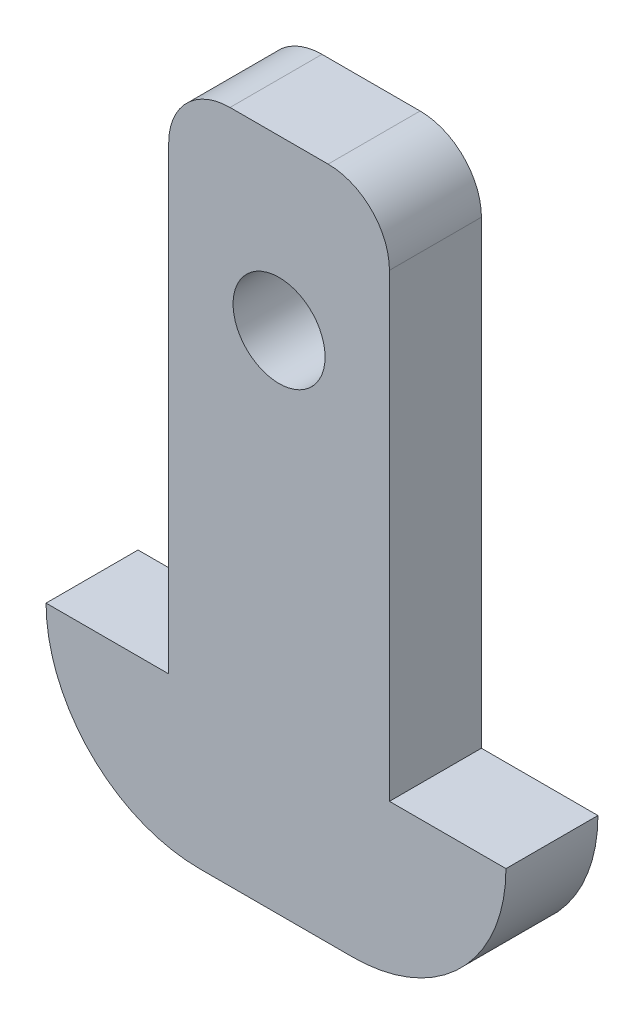
ISO-10303-21;
HEADER;
FILE_DESCRIPTION(('STEP AP214'),'2;1');
FILE_NAME('part.step','',(''),(''),'','','');
FILE_SCHEMA(('AUTOMOTIVE_DESIGN { 1 0 10303 214 1 1 1 1 }'));
ENDSEC;
DATA;
#1=APPLICATION_CONTEXT('core data for automotive mechanical design processes');
#2=APPLICATION_PROTOCOL_DEFINITION('international standard','automotive_design',2000,#1);
#3=PRODUCT_CONTEXT('',#1,'mechanical');
#4=PRODUCT('Part','Part','',(#3));
#5=PRODUCT_RELATED_PRODUCT_CATEGORY('part','',(#4));
#6=PRODUCT_DEFINITION_FORMATION('','',#4);
#7=PRODUCT_DEFINITION_CONTEXT('part definition',#1,'design');
#8=PRODUCT_DEFINITION('design','',#6,#7);
#9=PRODUCT_DEFINITION_SHAPE('','',#8);
#10=(LENGTH_UNIT() NAMED_UNIT(*) SI_UNIT(.MILLI.,.METRE.));
#11=(NAMED_UNIT(*) PLANE_ANGLE_UNIT() SI_UNIT($,.RADIAN.));
#12=(NAMED_UNIT(*) SI_UNIT($,.STERADIAN.) SOLID_ANGLE_UNIT());
#13=UNCERTAINTY_MEASURE_WITH_UNIT(LENGTH_MEASURE(1.E-05),#10,'distance_accuracy_value','');
#14=(GEOMETRIC_REPRESENTATION_CONTEXT(3) GLOBAL_UNCERTAINTY_ASSIGNED_CONTEXT((#13)) GLOBAL_UNIT_ASSIGNED_CONTEXT((#10,
#11,#12)) REPRESENTATION_CONTEXT('',''));
#15=CARTESIAN_POINT('',(0.,0.,0.));
#16=DIRECTION('',(0.,0.,1.));
#17=DIRECTION('',(1.,0.,0.));
#18=AXIS2_PLACEMENT_3D('',#15,#16,#17);
#19=CARTESIAN_POINT('',(15.,-5.,3.));
#20=DIRECTION('',(0.,1.,0.));
#21=DIRECTION('',(-1.,0.,0.));
#22=AXIS2_PLACEMENT_3D('',#19,#20,#21);
#23=PLANE('',#22);
#24=DIRECTION('',(1.,0.,0.));
#25=VECTOR('',#24,1.);
#26=CARTESIAN_POINT('',(15.,-5.,3.));
#27=LINE('',#26,#25);
#28=CARTESIAN_POINT('',(5.,-5.,3.));
#29=VERTEX_POINT('',#28);
#30=CARTESIAN_POINT('',(10.,-5.,3.));
#31=VERTEX_POINT('',#30);
#32=EDGE_CURVE('E131',#29,#31,#27,.T.);
#33=ORIENTED_EDGE('',*,*,#32,.F.);
#34=DIRECTION('',(0.,0.,-1.));
#35=VECTOR('',#34,1.);
#36=CARTESIAN_POINT('',(5.,-5.,3.));
#37=LINE('',#36,#35);
#38=CARTESIAN_POINT('',(5.,-5.,0.));
#39=VERTEX_POINT('',#38);
#40=EDGE_CURVE('E156',#29,#39,#37,.T.);
#41=ORIENTED_EDGE('',*,*,#40,.T.);
#42=DIRECTION('',(1.,0.,0.));
#43=VECTOR('',#42,1.);
#44=CARTESIAN_POINT('',(15.,-5.,0.));
#45=LINE('',#44,#43);
#46=CARTESIAN_POINT('',(10.,-5.,0.));
#47=VERTEX_POINT('',#46);
#48=EDGE_CURVE('E237',#39,#47,#45,.T.);
#49=ORIENTED_EDGE('',*,*,#48,.T.);
#50=DIRECTION('',(0.,0.,-1.));
#51=VECTOR('',#50,1.);
#52=CARTESIAN_POINT('',(10.,-5.,3.));
#53=LINE('',#52,#51);
#54=EDGE_CURVE('E152',#47,#31,#53,.F.);
#55=ORIENTED_EDGE('',*,*,#54,.T.);
#56=EDGE_LOOP('',(#33,#41,#49,#55));
#57=FACE_BOUND('',#56,.T.);
#58=ADVANCED_FACE('F45',(#57),#23,.F.);
#59=CARTESIAN_POINT('',(11.2,0.,3.));
#60=DIRECTION('',(0.,-1.,0.));
#61=DIRECTION('',(0.,0.,-1.));
#62=AXIS2_PLACEMENT_3D('',#59,#60,#61);
#63=PLANE('',#62);
#64=DIRECTION('',(-1.,0.,0.));
#65=VECTOR('',#64,1.);
#66=CARTESIAN_POINT('',(11.2,0.,0.));
#67=LINE('',#66,#65);
#68=CARTESIAN_POINT('',(15.,0.,0.));
#69=VERTEX_POINT('',#68);
#70=CARTESIAN_POINT('',(11.2,0.,0.));
#71=VERTEX_POINT('',#70);
#72=EDGE_CURVE('E221',#69,#71,#67,.T.);
#73=ORIENTED_EDGE('',*,*,#72,.T.);
#74=DIRECTION('',(0.,0.,-1.));
#75=VECTOR('',#74,1.);
#76=CARTESIAN_POINT('',(11.2,0.,3.));
#77=LINE('',#76,#75);
#78=CARTESIAN_POINT('',(11.2,0.,3.));
#79=VERTEX_POINT('',#78);
#80=EDGE_CURVE('E145',#79,#71,#77,.T.);
#81=ORIENTED_EDGE('',*,*,#80,.F.);
#82=DIRECTION('',(-1.,0.,0.));
#83=VECTOR('',#82,1.);
#84=CARTESIAN_POINT('',(11.2,0.,3.));
#85=LINE('',#84,#83);
#86=CARTESIAN_POINT('',(15.,0.,3.));
#87=VERTEX_POINT('',#86);
#88=EDGE_CURVE('E128',#87,#79,#85,.T.);
#89=ORIENTED_EDGE('',*,*,#88,.F.);
#90=DIRECTION('',(0.,0.,-1.));
#91=VECTOR('',#90,1.);
#92=CARTESIAN_POINT('',(15.,0.,3.));
#93=LINE('',#92,#91);
#94=EDGE_CURVE('E142',#87,#69,#93,.T.);
#95=ORIENTED_EDGE('',*,*,#94,.T.);
#96=EDGE_LOOP('',(#73,#81,#89,#95));
#97=FACE_BOUND('',#96,.T.);
#98=ADVANCED_FACE('F141',(#97),#63,.F.);
#99=CARTESIAN_POINT('',(11.2,17.,3.));
#100=DIRECTION('',(-1.,0.,0.));
#101=DIRECTION('',(0.,-1.,0.));
#102=AXIS2_PLACEMENT_3D('',#99,#100,#101);
#103=PLANE('',#102);
#104=DIRECTION('',(0.,1.,0.));
#105=VECTOR('',#104,1.);
#106=CARTESIAN_POINT('',(11.2,17.,0.));
#107=LINE('',#106,#105);
#108=CARTESIAN_POINT('',(11.2,15.,0.));
#109=VERTEX_POINT('',#108);
#110=EDGE_CURVE('E215',#71,#109,#107,.T.);
#111=ORIENTED_EDGE('',*,*,#110,.T.);
#112=DIRECTION('',(0.,0.,-1.));
#113=VECTOR('',#112,1.);
#114=CARTESIAN_POINT('',(11.2,15.,3.));
#115=LINE('',#114,#113);
#116=CARTESIAN_POINT('',(11.2,15.,3.));
#117=VERTEX_POINT('',#116);
#118=EDGE_CURVE('E11',#109,#117,#115,.F.);
#119=ORIENTED_EDGE('',*,*,#118,.T.);
#120=DIRECTION('',(0.,1.,0.));
#121=VECTOR('',#120,1.);
#122=CARTESIAN_POINT('',(11.2,17.,3.));
#123=LINE('',#122,#121);
#124=EDGE_CURVE('E147',#79,#117,#123,.T.);
#125=ORIENTED_EDGE('',*,*,#124,.F.);
#126=ORIENTED_EDGE('',*,*,#80,.T.);
#127=EDGE_LOOP('',(#111,#119,#125,#126));
#128=FACE_BOUND('',#127,.T.);
#129=ADVANCED_FACE('F259',(#128),#103,.F.);
#130=CARTESIAN_POINT('',(4.,17.,3.));
#131=DIRECTION('',(0.,-1.,0.));
#132=DIRECTION('',(0.,0.,-1.));
#133=AXIS2_PLACEMENT_3D('',#130,#131,#132);
#134=PLANE('',#133);
#135=DIRECTION('',(-1.,0.,0.));
#136=VECTOR('',#135,1.);
#137=CARTESIAN_POINT('',(4.,17.,0.));
#138=LINE('',#137,#136);
#139=CARTESIAN_POINT('',(9.2,17.,0.));
#140=VERTEX_POINT('',#139);
#141=CARTESIAN_POINT('',(6.,17.,0.));
#142=VERTEX_POINT('',#141);
#143=EDGE_CURVE('E209',#140,#142,#138,.T.);
#144=ORIENTED_EDGE('',*,*,#143,.T.);
#145=DIRECTION('',(0.,0.,-1.));
#146=VECTOR('',#145,1.);
#147=CARTESIAN_POINT('',(6.,17.,3.));
#148=LINE('',#147,#146);
#149=CARTESIAN_POINT('',(6.,17.,3.));
#150=VERTEX_POINT('',#149);
#151=EDGE_CURVE('E67',#142,#150,#148,.F.);
#152=ORIENTED_EDGE('',*,*,#151,.T.);
#153=DIRECTION('',(-1.,0.,0.));
#154=VECTOR('',#153,1.);
#155=CARTESIAN_POINT('',(4.,17.,3.));
#156=LINE('',#155,#154);
#157=CARTESIAN_POINT('',(9.2,17.,3.));
#158=VERTEX_POINT('',#157);
#159=EDGE_CURVE('E194',#158,#150,#156,.T.);
#160=ORIENTED_EDGE('',*,*,#159,.F.);
#161=DIRECTION('',(0.,0.,-1.));
#162=VECTOR('',#161,1.);
#163=CARTESIAN_POINT('',(9.2,17.,3.));
#164=LINE('',#163,#162);
#165=EDGE_CURVE('E181',#158,#140,#164,.T.);
#166=ORIENTED_EDGE('',*,*,#165,.T.);
#167=EDGE_LOOP('',(#144,#152,#160,#166));
#168=FACE_BOUND('',#167,.T.);
#169=ADVANCED_FACE('F212',(#168),#134,.F.);
#170=CARTESIAN_POINT('',(4.,0.,3.));
#171=DIRECTION('',(1.,0.,0.));
#172=DIRECTION('',(0.,0.,-1.));
#173=AXIS2_PLACEMENT_3D('',#170,#171,#172);
#174=PLANE('',#173);
#175=DIRECTION('',(0.,-1.,0.));
#176=VECTOR('',#175,1.);
#177=CARTESIAN_POINT('',(4.,0.,3.));
#178=LINE('',#177,#176);
#179=CARTESIAN_POINT('',(4.,15.,3.));
#180=VERTEX_POINT('',#179);
#181=CARTESIAN_POINT('',(4.,0.,3.));
#182=VERTEX_POINT('',#181);
#183=EDGE_CURVE('E192',#180,#182,#178,.T.);
#184=ORIENTED_EDGE('',*,*,#183,.F.);
#185=DIRECTION('',(0.,0.,-1.));
#186=VECTOR('',#185,1.);
#187=CARTESIAN_POINT('',(4.,15.,3.));
#188=LINE('',#187,#186);
#189=CARTESIAN_POINT('',(4.,15.,0.));
#190=VERTEX_POINT('',#189);
#191=EDGE_CURVE('E171',#180,#190,#188,.T.);
#192=ORIENTED_EDGE('',*,*,#191,.T.);
#193=DIRECTION('',(0.,-1.,0.));
#194=VECTOR('',#193,1.);
#195=CARTESIAN_POINT('',(4.,0.,0.));
#196=LINE('',#195,#194);
#197=CARTESIAN_POINT('',(4.,0.,0.));
#198=VERTEX_POINT('',#197);
#199=EDGE_CURVE('E211',#190,#198,#196,.T.);
#200=ORIENTED_EDGE('',*,*,#199,.T.);
#201=DIRECTION('',(0.,0.,-1.));
#202=VECTOR('',#201,1.);
#203=CARTESIAN_POINT('',(4.,0.,3.));
#204=LINE('',#203,#202);
#205=EDGE_CURVE('E158',#182,#198,#204,.T.);
#206=ORIENTED_EDGE('',*,*,#205,.F.);
#207=EDGE_LOOP('',(#184,#192,#200,#206));
#208=FACE_BOUND('',#207,.T.);
#209=ADVANCED_FACE('F198',(#208),#174,.F.);
#210=CARTESIAN_POINT('',(0.,0.,3.));
#211=DIRECTION('',(0.,-1.,0.));
#212=DIRECTION('',(0.,0.,-1.));
#213=AXIS2_PLACEMENT_3D('',#210,#211,#212);
#214=PLANE('',#213);
#215=DIRECTION('',(-1.,0.,0.));
#216=VECTOR('',#215,1.);
#217=CARTESIAN_POINT('',(0.,0.,0.));
#218=LINE('',#217,#216);
#219=CARTESIAN_POINT('',(0.,0.,0.));
#220=VERTEX_POINT('',#219);
#221=EDGE_CURVE('E219',#198,#220,#218,.T.);
#222=ORIENTED_EDGE('',*,*,#221,.T.);
#223=DIRECTION('',(0.,0.,-1.));
#224=VECTOR('',#223,1.);
#225=CARTESIAN_POINT('',(0.,0.,3.));
#226=LINE('',#225,#224);
#227=CARTESIAN_POINT('',(0.,0.,3.));
#228=VERTEX_POINT('',#227);
#229=EDGE_CURVE('E228',#228,#220,#226,.T.);
#230=ORIENTED_EDGE('',*,*,#229,.F.);
#231=DIRECTION('',(-1.,0.,0.));
#232=VECTOR('',#231,1.);
#233=CARTESIAN_POINT('',(0.,0.,3.));
#234=LINE('',#233,#232);
#235=EDGE_CURVE('E203',#182,#228,#234,.T.);
#236=ORIENTED_EDGE('',*,*,#235,.F.);
#237=ORIENTED_EDGE('',*,*,#205,.T.);
#238=EDGE_LOOP('',(#222,#230,#236,#237));
#239=FACE_BOUND('',#238,.T.);
#240=ADVANCED_FACE('F233',(#239),#214,.F.);
#241=CARTESIAN_POINT('',(0.,0.,3.));
#242=DIRECTION('',(0.,0.,-1.));
#243=DIRECTION('',(-1.,0.,0.));
#244=AXIS2_PLACEMENT_3D('',#241,#242,#243);
#245=PLANE('',#244);
#246=CARTESIAN_POINT('',(7.6,11.5,3.));
#247=DIRECTION('',(0.,0.,1.));
#248=DIRECTION('',(1.,0.,0.));
#249=AXIS2_PLACEMENT_3D('',#246,#247,#248);
#250=CIRCLE('',#249,1.5);
#251=CARTESIAN_POINT('',(9.1,11.5,3.));
#252=VERTEX_POINT('',#251);
#253=EDGE_CURVE('E246',#252,#252,#250,.T.);
#254=ORIENTED_EDGE('',*,*,#253,.F.);
#255=EDGE_LOOP('',(#254));
#256=FACE_BOUND('',#255,.T.);
#257=ORIENTED_EDGE('',*,*,#159,.T.);
#258=CARTESIAN_POINT('',(6.,15.,3.));
#259=DIRECTION('',(0.,0.,-1.));
#260=DIRECTION('',(-1.,0.,0.));
#261=AXIS2_PLACEMENT_3D('',#258,#259,#260);
#262=CIRCLE('',#261,2.);
#263=EDGE_CURVE('E54',#150,#180,#262,.F.);
#264=ORIENTED_EDGE('',*,*,#263,.T.);
#265=ORIENTED_EDGE('',*,*,#183,.T.);
#266=ORIENTED_EDGE('',*,*,#235,.T.);
#267=CARTESIAN_POINT('',(5.,0.,3.));
#268=DIRECTION('',(0.,0.,-1.));
#269=DIRECTION('',(-1.,0.,0.));
#270=AXIS2_PLACEMENT_3D('',#267,#268,#269);
#271=CIRCLE('',#270,5.);
#272=EDGE_CURVE('E136',#228,#29,#271,.F.);
#273=ORIENTED_EDGE('',*,*,#272,.T.);
#274=ORIENTED_EDGE('',*,*,#32,.T.);
#275=CARTESIAN_POINT('',(10.,0.,3.));
#276=DIRECTION('',(0.,0.,-1.));
#277=DIRECTION('',(-1.,0.,0.));
#278=AXIS2_PLACEMENT_3D('',#275,#276,#277);
#279=CIRCLE('',#278,5.);
#280=EDGE_CURVE('E125',#31,#87,#279,.F.);
#281=ORIENTED_EDGE('',*,*,#280,.T.);
#282=ORIENTED_EDGE('',*,*,#88,.T.);
#283=ORIENTED_EDGE('',*,*,#124,.T.);
#284=CARTESIAN_POINT('',(9.2,15.,3.));
#285=DIRECTION('',(0.,0.,-1.));
#286=DIRECTION('',(-1.,0.,0.));
#287=AXIS2_PLACEMENT_3D('',#284,#285,#286);
#288=CIRCLE('',#287,2.);
#289=EDGE_CURVE('E187',#117,#158,#288,.F.);
#290=ORIENTED_EDGE('',*,*,#289,.T.);
#291=EDGE_LOOP('',(#257,#264,#265,#266,#273,#274,#281,#282,#283,#290));
#292=FACE_BOUND('',#291,.T.);
#293=ADVANCED_FACE('F127',(#256,#292),#245,.F.);
#294=CARTESIAN_POINT('',(0.,0.,0.));
#295=DIRECTION('',(0.,0.,-1.));
#296=DIRECTION('',(-1.,0.,0.));
#297=AXIS2_PLACEMENT_3D('',#294,#295,#296);
#298=PLANE('',#297);
#299=CARTESIAN_POINT('',(7.6,11.5,0.));
#300=DIRECTION('',(0.,0.,1.));
#301=DIRECTION('',(1.,0.,0.));
#302=AXIS2_PLACEMENT_3D('',#299,#300,#301);
#303=CIRCLE('',#302,1.5);
#304=CARTESIAN_POINT('',(9.1,11.5,0.));
#305=VERTEX_POINT('',#304);
#306=EDGE_CURVE('E256',#305,#305,#303,.T.);
#307=ORIENTED_EDGE('',*,*,#306,.T.);
#308=EDGE_LOOP('',(#307));
#309=FACE_BOUND('',#308,.T.);
#310=ORIENTED_EDGE('',*,*,#199,.F.);
#311=CARTESIAN_POINT('',(6.,15.,0.));
#312=DIRECTION('',(0.,0.,-1.));
#313=DIRECTION('',(-1.,0.,0.));
#314=AXIS2_PLACEMENT_3D('',#311,#312,#313);
#315=CIRCLE('',#314,2.);
#316=EDGE_CURVE('E178',#190,#142,#315,.T.);
#317=ORIENTED_EDGE('',*,*,#316,.T.);
#318=ORIENTED_EDGE('',*,*,#143,.F.);
#319=CARTESIAN_POINT('',(9.2,15.,0.));
#320=DIRECTION('',(0.,0.,-1.));
#321=DIRECTION('',(-1.,0.,0.));
#322=AXIS2_PLACEMENT_3D('',#319,#320,#321);
#323=CIRCLE('',#322,2.);
#324=EDGE_CURVE('E175',#140,#109,#323,.T.);
#325=ORIENTED_EDGE('',*,*,#324,.T.);
#326=ORIENTED_EDGE('',*,*,#110,.F.);
#327=ORIENTED_EDGE('',*,*,#72,.F.);
#328=CARTESIAN_POINT('',(10.,0.,0.));
#329=DIRECTION('',(0.,0.,-1.));
#330=DIRECTION('',(-1.,0.,0.));
#331=AXIS2_PLACEMENT_3D('',#328,#329,#330);
#332=CIRCLE('',#331,5.);
#333=EDGE_CURVE('E150',#69,#47,#332,.T.);
#334=ORIENTED_EDGE('',*,*,#333,.T.);
#335=ORIENTED_EDGE('',*,*,#48,.F.);
#336=CARTESIAN_POINT('',(5.,0.,0.));
#337=DIRECTION('',(0.,0.,-1.));
#338=DIRECTION('',(-1.,0.,0.));
#339=AXIS2_PLACEMENT_3D('',#336,#337,#338);
#340=CIRCLE('',#339,5.);
#341=EDGE_CURVE('E137',#39,#220,#340,.T.);
#342=ORIENTED_EDGE('',*,*,#341,.T.);
#343=ORIENTED_EDGE('',*,*,#221,.F.);
#344=EDGE_LOOP('',(#310,#317,#318,#325,#326,#327,#334,#335,#342,#343));
#345=FACE_BOUND('',#344,.T.);
#346=ADVANCED_FACE('F208',(#309,#345),#298,.T.);
#347=CARTESIAN_POINT('',(7.6,11.5,0.));
#348=DIRECTION('',(0.,0.,1.));
#349=DIRECTION('',(1.,0.,0.));
#350=AXIS2_PLACEMENT_3D('',#347,#348,#349);
#351=CYLINDRICAL_SURFACE('',#350,1.5);
#352=ORIENTED_EDGE('',*,*,#306,.F.);
#353=EDGE_LOOP('',(#352));
#354=FACE_BOUND('',#353,.T.);
#355=ORIENTED_EDGE('',*,*,#253,.T.);
#356=EDGE_LOOP('',(#355));
#357=FACE_BOUND('',#356,.T.);
#358=ADVANCED_FACE('F276',(#354,#357),#351,.F.);
#359=CARTESIAN_POINT('',(5.,0.,3.));
#360=DIRECTION('',(0.,0.,-1.));
#361=DIRECTION('',(-1.,0.,0.));
#362=AXIS2_PLACEMENT_3D('',#359,#360,#361);
#363=CYLINDRICAL_SURFACE('',#362,5.);
#364=ORIENTED_EDGE('',*,*,#272,.F.);
#365=ORIENTED_EDGE('',*,*,#229,.T.);
#366=ORIENTED_EDGE('',*,*,#341,.F.);
#367=ORIENTED_EDGE('',*,*,#40,.F.);
#368=EDGE_LOOP('',(#364,#365,#366,#367));
#369=FACE_BOUND('',#368,.T.);
#370=ADVANCED_FACE('F241',(#369),#363,.T.);
#371=CARTESIAN_POINT('',(10.,0.,3.));
#372=DIRECTION('',(0.,0.,-1.));
#373=DIRECTION('',(-1.,0.,0.));
#374=AXIS2_PLACEMENT_3D('',#371,#372,#373);
#375=CYLINDRICAL_SURFACE('',#374,5.);
#376=ORIENTED_EDGE('',*,*,#280,.F.);
#377=ORIENTED_EDGE('',*,*,#54,.F.);
#378=ORIENTED_EDGE('',*,*,#333,.F.);
#379=ORIENTED_EDGE('',*,*,#94,.F.);
#380=EDGE_LOOP('',(#376,#377,#378,#379));
#381=FACE_BOUND('',#380,.T.);
#382=ADVANCED_FACE('F149',(#381),#375,.T.);
#383=CARTESIAN_POINT('',(6.,15.,3.));
#384=DIRECTION('',(0.,0.,-1.));
#385=DIRECTION('',(-1.,0.,0.));
#386=AXIS2_PLACEMENT_3D('',#383,#384,#385);
#387=CYLINDRICAL_SURFACE('',#386,2.);
#388=ORIENTED_EDGE('',*,*,#263,.F.);
#389=ORIENTED_EDGE('',*,*,#151,.F.);
#390=ORIENTED_EDGE('',*,*,#316,.F.);
#391=ORIENTED_EDGE('',*,*,#191,.F.);
#392=EDGE_LOOP('',(#388,#389,#390,#391));
#393=FACE_BOUND('',#392,.T.);
#394=ADVANCED_FACE('F205',(#393),#387,.T.);
#395=CARTESIAN_POINT('',(9.2,15.,3.));
#396=DIRECTION('',(0.,0.,-1.));
#397=DIRECTION('',(-1.,0.,0.));
#398=AXIS2_PLACEMENT_3D('',#395,#396,#397);
#399=CYLINDRICAL_SURFACE('',#398,2.);
#400=ORIENTED_EDGE('',*,*,#289,.F.);
#401=ORIENTED_EDGE('',*,*,#118,.F.);
#402=ORIENTED_EDGE('',*,*,#324,.F.);
#403=ORIENTED_EDGE('',*,*,#165,.F.);
#404=EDGE_LOOP('',(#400,#401,#402,#403));
#405=FACE_BOUND('',#404,.T.);
#406=ADVANCED_FACE('F47',(#405),#399,.T.);
#407=CLOSED_SHELL('',(#58,#98,#129,#169,#209,#240,#293,#346,#358,#370,#382,#394,#406));
#408=MANIFOLD_SOLID_BREP('B2',#407);
#409=ADVANCED_BREP_SHAPE_REPRESENTATION('',(#18,#408),#14);
#410=SHAPE_DEFINITION_REPRESENTATION(#9,#409);
ENDSEC;
END-ISO-10303-21;
